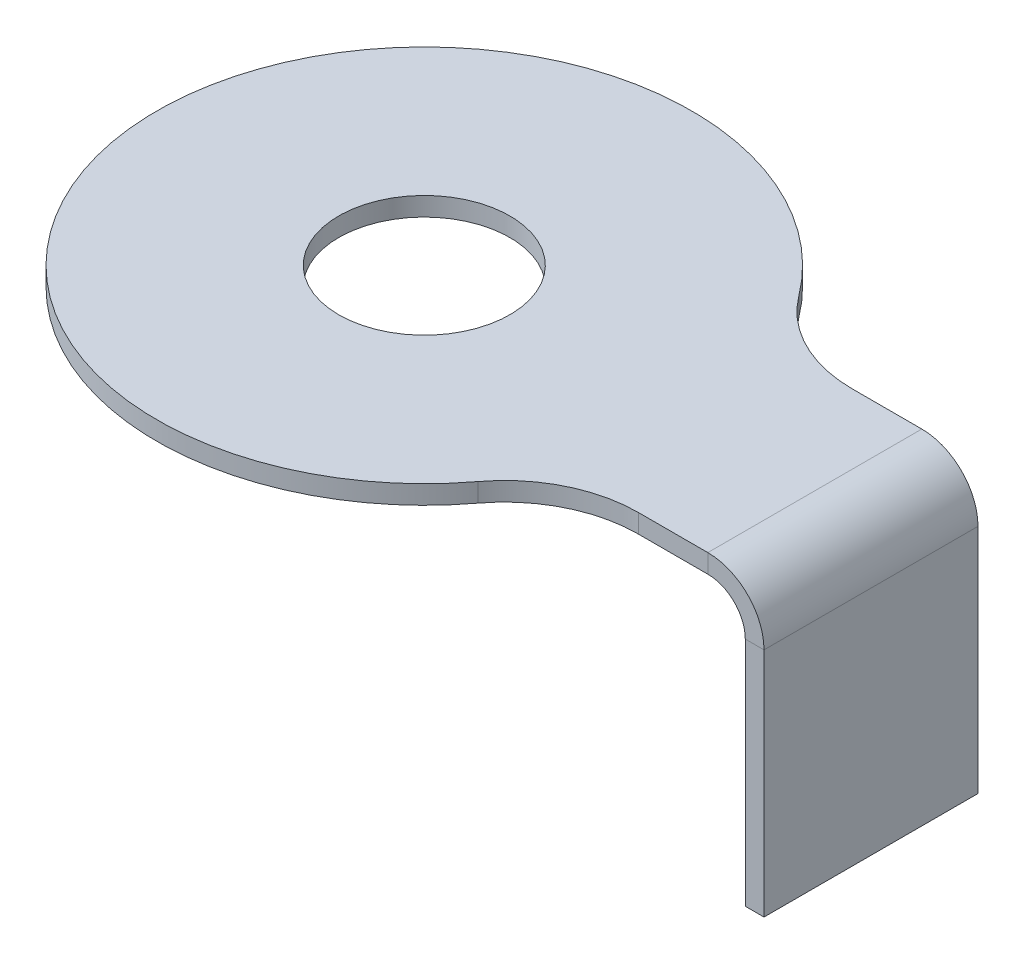
ISO-10303-21;
HEADER;
FILE_DESCRIPTION(('STEP AP214'),'2;1');
FILE_NAME('part.step','',(''),(''),'','','');
FILE_SCHEMA(('AUTOMOTIVE_DESIGN { 1 0 10303 214 1 1 1 1 }'));
ENDSEC;
DATA;
#1=APPLICATION_CONTEXT('core data for automotive mechanical design processes');
#2=APPLICATION_PROTOCOL_DEFINITION('international standard','automotive_design',2000,#1);
#3=PRODUCT_CONTEXT('',#1,'mechanical');
#4=PRODUCT('Part','Part','',(#3));
#5=PRODUCT_RELATED_PRODUCT_CATEGORY('part','',(#4));
#6=PRODUCT_DEFINITION_FORMATION('','',#4);
#7=PRODUCT_DEFINITION_CONTEXT('part definition',#1,'design');
#8=PRODUCT_DEFINITION('design','',#6,#7);
#9=PRODUCT_DEFINITION_SHAPE('','',#8);
#10=(LENGTH_UNIT() NAMED_UNIT(*) SI_UNIT(.MILLI.,.METRE.));
#11=(NAMED_UNIT(*) PLANE_ANGLE_UNIT() SI_UNIT($,.RADIAN.));
#12=(NAMED_UNIT(*) SI_UNIT($,.STERADIAN.) SOLID_ANGLE_UNIT());
#13=UNCERTAINTY_MEASURE_WITH_UNIT(LENGTH_MEASURE(1.E-05),#10,'distance_accuracy_value','');
#14=(GEOMETRIC_REPRESENTATION_CONTEXT(3) GLOBAL_UNCERTAINTY_ASSIGNED_CONTEXT((#13)) GLOBAL_UNIT_ASSIGNED_CONTEXT((#10,
#11,#12)) REPRESENTATION_CONTEXT('',''));
#15=CARTESIAN_POINT('',(0.,0.,0.));
#16=DIRECTION('',(0.,0.,1.));
#17=DIRECTION('',(1.,0.,0.));
#18=AXIS2_PLACEMENT_3D('',#15,#16,#17);
#19=CARTESIAN_POINT('',(8.35000000000001,1.97444678594554,-4.5));
#20=DIRECTION('',(-1.,0.,0.));
#21=DIRECTION('',(0.,0.,-1.));
#22=AXIS2_PLACEMENT_3D('',#19,#20,#21);
#23=PLANE('',#22);
#24=DIRECTION('',(0.,1.,0.));
#25=VECTOR('',#24,1.);
#26=CARTESIAN_POINT('',(8.35000000000001,1.97444678594554,-2.));
#27=LINE('',#26,#25);
#28=CARTESIAN_POINT('',(8.34999999999999,-5.02555321405446,-2.));
#29=VERTEX_POINT('',#28);
#30=CARTESIAN_POINT('',(8.35000000510995,-0.700000000000003,-2.));
#31=VERTEX_POINT('',#30);
#32=EDGE_CURVE('E39',#29,#31,#27,.T.);
#33=ORIENTED_EDGE('',*,*,#32,.T.);
#34=DIRECTION('',(0.,0.,1.));
#35=VECTOR('',#34,1.);
#36=CARTESIAN_POINT('',(8.35,-0.700000000000004,-4.5));
#37=LINE('',#36,#35);
#38=CARTESIAN_POINT('',(8.35,-0.700000000000004,2.));
#39=VERTEX_POINT('',#38);
#40=EDGE_CURVE('E127',#31,#39,#37,.T.);
#41=ORIENTED_EDGE('',*,*,#40,.T.);
#42=DIRECTION('',(0.,-1.,0.));
#43=VECTOR('',#42,1.);
#44=CARTESIAN_POINT('',(8.34999999999999,-5.02555321405446,2.));
#45=LINE('',#44,#43);
#46=CARTESIAN_POINT('',(8.34999999999999,-5.02555321405446,2.));
#47=VERTEX_POINT('',#46);
#48=EDGE_CURVE('E146',#39,#47,#45,.T.);
#49=ORIENTED_EDGE('',*,*,#48,.T.);
#50=DIRECTION('',(0.,0.,-1.));
#51=VECTOR('',#50,1.);
#52=CARTESIAN_POINT('',(8.34999999999999,-5.02555321405446,-2.));
#53=LINE('',#52,#51);
#54=EDGE_CURVE('E60',#47,#29,#53,.T.);
#55=ORIENTED_EDGE('',*,*,#54,.T.);
#56=EDGE_LOOP('',(#33,#41,#49,#55));
#57=FACE_BOUND('',#56,.T.);
#58=ADVANCED_FACE('F35',(#57),#23,.F.);
#59=CARTESIAN_POINT('',(8.34999999999999,-5.02555321405446,2.));
#60=DIRECTION('',(0.,0.,-1.));
#61=DIRECTION('',(0.,1.,0.));
#62=AXIS2_PLACEMENT_3D('',#59,#60,#61);
#63=PLANE('',#62);
#64=ORIENTED_EDGE('',*,*,#48,.F.);
#65=DIRECTION('',(-1.,0.,0.));
#66=VECTOR('',#65,1.);
#67=CARTESIAN_POINT('',(8.35,-0.700000000000004,2.));
#68=LINE('',#67,#66);
#69=CARTESIAN_POINT('',(8.00000000510995,-0.700000000000002,2.));
#70=VERTEX_POINT('',#69);
#71=EDGE_CURVE('E12',#39,#70,#68,.T.);
#72=ORIENTED_EDGE('',*,*,#71,.T.);
#73=DIRECTION('',(0.,-1.,0.));
#74=VECTOR('',#73,1.);
#75=CARTESIAN_POINT('',(7.99999999999999,-5.02555321405446,2.));
#76=LINE('',#75,#74);
#77=CARTESIAN_POINT('',(7.99999999999999,-5.02555321405446,2.));
#78=VERTEX_POINT('',#77);
#79=EDGE_CURVE('E151',#70,#78,#76,.T.);
#80=ORIENTED_EDGE('',*,*,#79,.T.);
#81=DIRECTION('',(-1.,0.,0.));
#82=VECTOR('',#81,1.);
#83=CARTESIAN_POINT('',(8.34999999999999,-5.02555321405446,2.));
#84=LINE('',#83,#82);
#85=EDGE_CURVE('E164',#47,#78,#84,.T.);
#86=ORIENTED_EDGE('',*,*,#85,.F.);
#87=EDGE_LOOP('',(#64,#72,#80,#86));
#88=FACE_BOUND('',#87,.T.);
#89=ADVANCED_FACE('F37',(#88),#63,.F.);
#90=CARTESIAN_POINT('',(8.35000000000001,1.97444678594554,-2.));
#91=DIRECTION('',(0.,0.,1.));
#92=DIRECTION('',(0.,-1.,0.));
#93=AXIS2_PLACEMENT_3D('',#90,#91,#92);
#94=PLANE('',#93);
#95=DIRECTION('',(0.,1.,0.));
#96=VECTOR('',#95,1.);
#97=CARTESIAN_POINT('',(8.00000000000001,1.97444678594554,-2.));
#98=LINE('',#97,#96);
#99=CARTESIAN_POINT('',(7.99999999999999,-5.02555321405446,-2.));
#100=VERTEX_POINT('',#99);
#101=CARTESIAN_POINT('',(8.00000000510995,-0.700000000000002,-2.));
#102=VERTEX_POINT('',#101);
#103=EDGE_CURVE('E141',#100,#102,#98,.T.);
#104=ORIENTED_EDGE('',*,*,#103,.T.);
#105=DIRECTION('',(1.,0.,0.));
#106=VECTOR('',#105,1.);
#107=CARTESIAN_POINT('',(8.35,-0.700000000000004,-2.));
#108=LINE('',#107,#106);
#109=EDGE_CURVE('E117',#102,#31,#108,.T.);
#110=ORIENTED_EDGE('',*,*,#109,.T.);
#111=ORIENTED_EDGE('',*,*,#32,.F.);
#112=DIRECTION('',(-1.,0.,0.));
#113=VECTOR('',#112,1.);
#114=CARTESIAN_POINT('',(8.34999999999999,-5.02555321405446,-2.));
#115=LINE('',#114,#113);
#116=EDGE_CURVE('E143',#29,#100,#115,.T.);
#117=ORIENTED_EDGE('',*,*,#116,.T.);
#118=EDGE_LOOP('',(#104,#110,#111,#117));
#119=FACE_BOUND('',#118,.T.);
#120=ADVANCED_FACE('F142',(#119),#94,.F.);
#121=CARTESIAN_POINT('',(8.00000000000001,1.97444678594554,-4.5));
#122=DIRECTION('',(-1.,0.,0.));
#123=DIRECTION('',(0.,0.,-1.));
#124=AXIS2_PLACEMENT_3D('',#121,#122,#123);
#125=PLANE('',#124);
#126=DIRECTION('',(0.,0.,1.));
#127=VECTOR('',#126,1.);
#128=CARTESIAN_POINT('',(8.,-0.700000000000003,-4.5));
#129=LINE('',#128,#127);
#130=EDGE_CURVE('E44',#102,#70,#129,.T.);
#131=ORIENTED_EDGE('',*,*,#130,.F.);
#132=ORIENTED_EDGE('',*,*,#103,.F.);
#133=DIRECTION('',(0.,0.,-1.));
#134=VECTOR('',#133,1.);
#135=CARTESIAN_POINT('',(7.99999999999999,-5.02555321405446,-2.));
#136=LINE('',#135,#134);
#137=EDGE_CURVE('E147',#78,#100,#136,.T.);
#138=ORIENTED_EDGE('',*,*,#137,.F.);
#139=ORIENTED_EDGE('',*,*,#79,.F.);
#140=EDGE_LOOP('',(#131,#132,#138,#139));
#141=FACE_BOUND('',#140,.T.);
#142=ADVANCED_FACE('F150',(#141),#125,.T.);
#143=CARTESIAN_POINT('',(8.34999999999999,-5.02555321405446,-2.));
#144=DIRECTION('',(0.,1.,0.));
#145=DIRECTION('',(0.,0.,1.));
#146=AXIS2_PLACEMENT_3D('',#143,#144,#145);
#147=PLANE('',#146);
#148=ORIENTED_EDGE('',*,*,#137,.T.);
#149=ORIENTED_EDGE('',*,*,#116,.F.);
#150=ORIENTED_EDGE('',*,*,#54,.F.);
#151=ORIENTED_EDGE('',*,*,#85,.T.);
#152=EDGE_LOOP('',(#148,#149,#150,#151));
#153=FACE_BOUND('',#152,.T.);
#154=ADVANCED_FACE('F168',(#153),#147,.F.);
#155=CARTESIAN_POINT('',(0.,0.35,0.));
#156=DIRECTION('',(0.,-1.,0.));
#157=DIRECTION('',(0.,0.,-1.));
#158=AXIS2_PLACEMENT_3D('',#155,#156,#157);
#159=CYLINDRICAL_SURFACE('',#158,1.6);
#160=CARTESIAN_POINT('',(0.,0.35,0.));
#161=DIRECTION('',(0.,1.,0.));
#162=DIRECTION('',(0.,0.,1.));
#163=AXIS2_PLACEMENT_3D('',#160,#161,#162);
#164=CIRCLE('',#163,1.6);
#165=CARTESIAN_POINT('',(0.,0.35,1.6));
#166=VERTEX_POINT('',#165);
#167=EDGE_CURVE('E326',#166,#166,#164,.T.);
#168=ORIENTED_EDGE('',*,*,#167,.T.);
#169=EDGE_LOOP('',(#168));
#170=FACE_BOUND('',#169,.T.);
#171=CARTESIAN_POINT('',(0.,0.,0.));
#172=DIRECTION('',(0.,1.,0.));
#173=DIRECTION('',(0.,0.,1.));
#174=AXIS2_PLACEMENT_3D('',#171,#172,#173);
#175=CIRCLE('',#174,1.6);
#176=CARTESIAN_POINT('',(0.,0.,1.6));
#177=VERTEX_POINT('',#176);
#178=EDGE_CURVE('E295',#177,#177,#175,.T.);
#179=ORIENTED_EDGE('',*,*,#178,.F.);
#180=EDGE_LOOP('',(#179));
#181=FACE_BOUND('',#180,.T.);
#182=ADVANCED_FACE('F170',(#170,#181),#159,.F.);
#183=CARTESIAN_POINT('',(6.,0.35,4.5));
#184=DIRECTION('',(0.,-1.,0.));
#185=DIRECTION('',(0.,0.,-1.));
#186=AXIS2_PLACEMENT_3D('',#183,#184,#185);
#187=CYLINDRICAL_SURFACE('',#186,2.5);
#188=CARTESIAN_POINT('',(6.,0.,4.5));
#189=DIRECTION('',(0.,-1.,0.));
#190=DIRECTION('',(0.,0.,1.));
#191=AXIS2_PLACEMENT_3D('',#188,#189,#190);
#192=CIRCLE('',#191,2.5);
#193=CARTESIAN_POINT('',(4.,0.,3.));
#194=VERTEX_POINT('',#193);
#195=CARTESIAN_POINT('',(6.,0.,2.));
#196=VERTEX_POINT('',#195);
#197=EDGE_CURVE('E324',#194,#196,#192,.T.);
#198=ORIENTED_EDGE('',*,*,#197,.T.);
#199=DIRECTION('',(0.,-1.,0.));
#200=VECTOR('',#199,1.);
#201=CARTESIAN_POINT('',(6.,0.35,2.));
#202=LINE('',#201,#200);
#203=CARTESIAN_POINT('',(6.,0.35,2.));
#204=VERTEX_POINT('',#203);
#205=EDGE_CURVE('E292',#204,#196,#202,.T.);
#206=ORIENTED_EDGE('',*,*,#205,.F.);
#207=CARTESIAN_POINT('',(6.,0.35,4.5));
#208=DIRECTION('',(0.,-1.,0.));
#209=DIRECTION('',(0.,0.,1.));
#210=AXIS2_PLACEMENT_3D('',#207,#208,#209);
#211=CIRCLE('',#210,2.5);
#212=CARTESIAN_POINT('',(4.,0.35,3.));
#213=VERTEX_POINT('',#212);
#214=EDGE_CURVE('E301',#213,#204,#211,.T.);
#215=ORIENTED_EDGE('',*,*,#214,.F.);
#216=DIRECTION('',(0.,-1.,0.));
#217=VECTOR('',#216,1.);
#218=CARTESIAN_POINT('',(4.,0.35,3.));
#219=LINE('',#218,#217);
#220=EDGE_CURVE('E321',#213,#194,#219,.T.);
#221=ORIENTED_EDGE('',*,*,#220,.T.);
#222=EDGE_LOOP('',(#198,#206,#215,#221));
#223=FACE_BOUND('',#222,.T.);
#224=ADVANCED_FACE('F176',(#223),#187,.F.);
#225=CARTESIAN_POINT('',(0.,0.35,0.));
#226=DIRECTION('',(0.,-1.,0.));
#227=DIRECTION('',(0.,0.,-1.));
#228=AXIS2_PLACEMENT_3D('',#225,#226,#227);
#229=CYLINDRICAL_SURFACE('',#228,5.);
#230=CARTESIAN_POINT('',(0.,0.,0.));
#231=DIRECTION('',(0.,1.,0.));
#232=DIRECTION('',(0.,0.,1.));
#233=AXIS2_PLACEMENT_3D('',#230,#231,#232);
#234=CIRCLE('',#233,5.);
#235=CARTESIAN_POINT('',(4.,0.,-3.));
#236=VERTEX_POINT('',#235);
#237=EDGE_CURVE('E319',#236,#194,#234,.T.);
#238=ORIENTED_EDGE('',*,*,#237,.T.);
#239=ORIENTED_EDGE('',*,*,#220,.F.);
#240=CARTESIAN_POINT('',(0.,0.35,0.));
#241=DIRECTION('',(0.,1.,0.));
#242=DIRECTION('',(0.,0.,1.));
#243=AXIS2_PLACEMENT_3D('',#240,#241,#242);
#244=CIRCLE('',#243,5.);
#245=CARTESIAN_POINT('',(4.,0.35,-3.));
#246=VERTEX_POINT('',#245);
#247=EDGE_CURVE('E303',#246,#213,#244,.T.);
#248=ORIENTED_EDGE('',*,*,#247,.F.);
#249=DIRECTION('',(0.,-1.,0.));
#250=VECTOR('',#249,1.);
#251=CARTESIAN_POINT('',(4.,0.35,-3.));
#252=LINE('',#251,#250);
#253=EDGE_CURVE('E316',#246,#236,#252,.T.);
#254=ORIENTED_EDGE('',*,*,#253,.T.);
#255=EDGE_LOOP('',(#238,#239,#248,#254));
#256=FACE_BOUND('',#255,.T.);
#257=ADVANCED_FACE('F262',(#256),#229,.T.);
#258=CARTESIAN_POINT('',(6.,0.35,-4.5));
#259=DIRECTION('',(0.,-1.,0.));
#260=DIRECTION('',(0.,0.,-1.));
#261=AXIS2_PLACEMENT_3D('',#258,#259,#260);
#262=CYLINDRICAL_SURFACE('',#261,2.5);
#263=CARTESIAN_POINT('',(6.,0.,-4.5));
#264=DIRECTION('',(0.,-1.,0.));
#265=DIRECTION('',(0.,0.,-1.));
#266=AXIS2_PLACEMENT_3D('',#263,#264,#265);
#267=CIRCLE('',#266,2.5);
#268=CARTESIAN_POINT('',(6.,0.,-2.));
#269=VERTEX_POINT('',#268);
#270=EDGE_CURVE('E313',#269,#236,#267,.T.);
#271=ORIENTED_EDGE('',*,*,#270,.T.);
#272=ORIENTED_EDGE('',*,*,#253,.F.);
#273=CARTESIAN_POINT('',(6.,0.35,-4.5));
#274=DIRECTION('',(0.,-1.,0.));
#275=DIRECTION('',(0.,0.,-1.));
#276=AXIS2_PLACEMENT_3D('',#273,#274,#275);
#277=CIRCLE('',#276,2.5);
#278=CARTESIAN_POINT('',(6.,0.35,-2.));
#279=VERTEX_POINT('',#278);
#280=EDGE_CURVE('E305',#279,#246,#277,.T.);
#281=ORIENTED_EDGE('',*,*,#280,.F.);
#282=DIRECTION('',(0.,-1.,0.));
#283=VECTOR('',#282,1.);
#284=CARTESIAN_POINT('',(6.,0.35,-2.));
#285=LINE('',#284,#283);
#286=EDGE_CURVE('E310',#279,#269,#285,.T.);
#287=ORIENTED_EDGE('',*,*,#286,.T.);
#288=EDGE_LOOP('',(#271,#272,#281,#287));
#289=FACE_BOUND('',#288,.T.);
#290=ADVANCED_FACE('F213',(#289),#262,.F.);
#291=CARTESIAN_POINT('',(6.,0.35,-4.5));
#292=DIRECTION('',(0.,-1.,0.));
#293=DIRECTION('',(0.,0.,-1.));
#294=AXIS2_PLACEMENT_3D('',#291,#292,#293);
#295=PLANE('',#294);
#296=DIRECTION('',(0.,0.,1.));
#297=VECTOR('',#296,1.);
#298=CARTESIAN_POINT('',(7.3,0.35,-4.5));
#299=LINE('',#298,#297);
#300=CARTESIAN_POINT('',(7.3,0.350000002554975,-2.));
#301=VERTEX_POINT('',#300);
#302=CARTESIAN_POINT('',(7.3,0.35,2.));
#303=VERTEX_POINT('',#302);
#304=EDGE_CURVE('E284',#301,#303,#299,.T.);
#305=ORIENTED_EDGE('',*,*,#304,.F.);
#306=DIRECTION('',(-1.,0.,0.));
#307=VECTOR('',#306,1.);
#308=CARTESIAN_POINT('',(6.,0.35,-2.));
#309=LINE('',#308,#307);
#310=EDGE_CURVE('E308',#301,#279,#309,.T.);
#311=ORIENTED_EDGE('',*,*,#310,.T.);
#312=ORIENTED_EDGE('',*,*,#280,.T.);
#313=ORIENTED_EDGE('',*,*,#247,.T.);
#314=ORIENTED_EDGE('',*,*,#214,.T.);
#315=DIRECTION('',(1.,0.,0.));
#316=VECTOR('',#315,1.);
#317=CARTESIAN_POINT('',(13.,0.35,2.));
#318=LINE('',#317,#316);
#319=EDGE_CURVE('E281',#204,#303,#318,.T.);
#320=ORIENTED_EDGE('',*,*,#319,.T.);
#321=EDGE_LOOP('',(#305,#311,#312,#313,#314,#320));
#322=FACE_BOUND('',#321,.T.);
#323=ORIENTED_EDGE('',*,*,#167,.F.);
#324=EDGE_LOOP('',(#323));
#325=FACE_BOUND('',#324,.T.);
#326=ADVANCED_FACE('F206',(#322,#325),#295,.F.);
#327=CARTESIAN_POINT('',(6.,0.35,-2.));
#328=DIRECTION('',(0.,0.,1.));
#329=DIRECTION('',(1.,0.,0.));
#330=AXIS2_PLACEMENT_3D('',#327,#328,#329);
#331=PLANE('',#330);
#332=DIRECTION('',(0.,1.,0.));
#333=VECTOR('',#332,1.);
#334=CARTESIAN_POINT('',(7.3,0.35,-2.));
#335=LINE('',#334,#333);
#336=CARTESIAN_POINT('',(7.3,0.,-2.));
#337=VERTEX_POINT('',#336);
#338=EDGE_CURVE('E283',#337,#301,#335,.T.);
#339=ORIENTED_EDGE('',*,*,#338,.F.);
#340=DIRECTION('',(-1.,0.,0.));
#341=VECTOR('',#340,1.);
#342=CARTESIAN_POINT('',(6.,0.,-2.));
#343=LINE('',#342,#341);
#344=EDGE_CURVE('E298',#337,#269,#343,.T.);
#345=ORIENTED_EDGE('',*,*,#344,.T.);
#346=ORIENTED_EDGE('',*,*,#286,.F.);
#347=ORIENTED_EDGE('',*,*,#310,.F.);
#348=EDGE_LOOP('',(#339,#345,#346,#347));
#349=FACE_BOUND('',#348,.T.);
#350=ADVANCED_FACE('F212',(#349),#331,.F.);
#351=CARTESIAN_POINT('',(6.,0.,-4.5));
#352=DIRECTION('',(0.,-1.,0.));
#353=DIRECTION('',(0.,0.,-1.));
#354=AXIS2_PLACEMENT_3D('',#351,#352,#353);
#355=PLANE('',#354);
#356=ORIENTED_EDGE('',*,*,#178,.T.);
#357=EDGE_LOOP('',(#356));
#358=FACE_BOUND('',#357,.T.);
#359=ORIENTED_EDGE('',*,*,#344,.F.);
#360=DIRECTION('',(0.,0.,1.));
#361=VECTOR('',#360,1.);
#362=CARTESIAN_POINT('',(7.3,0.,-4.5));
#363=LINE('',#362,#361);
#364=CARTESIAN_POINT('',(7.3,0.,2.));
#365=VERTEX_POINT('',#364);
#366=EDGE_CURVE('E136',#337,#365,#363,.T.);
#367=ORIENTED_EDGE('',*,*,#366,.T.);
#368=DIRECTION('',(1.,0.,0.));
#369=VECTOR('',#368,1.);
#370=CARTESIAN_POINT('',(13.,0.,2.));
#371=LINE('',#370,#369);
#372=EDGE_CURVE('E155',#196,#365,#371,.T.);
#373=ORIENTED_EDGE('',*,*,#372,.F.);
#374=ORIENTED_EDGE('',*,*,#197,.F.);
#375=ORIENTED_EDGE('',*,*,#237,.F.);
#376=ORIENTED_EDGE('',*,*,#270,.F.);
#377=EDGE_LOOP('',(#359,#367,#373,#374,#375,#376));
#378=FACE_BOUND('',#377,.T.);
#379=ADVANCED_FACE('F270',(#358,#378),#355,.T.);
#380=CARTESIAN_POINT('',(13.,0.35,2.));
#381=DIRECTION('',(0.,0.,-1.));
#382=DIRECTION('',(-1.,0.,0.));
#383=AXIS2_PLACEMENT_3D('',#380,#381,#382);
#384=PLANE('',#383);
#385=DIRECTION('',(0.,-1.,0.));
#386=VECTOR('',#385,1.);
#387=CARTESIAN_POINT('',(7.3,0.35,2.));
#388=LINE('',#387,#386);
#389=EDGE_CURVE('E279',#303,#365,#388,.T.);
#390=ORIENTED_EDGE('',*,*,#389,.F.);
#391=ORIENTED_EDGE('',*,*,#319,.F.);
#392=ORIENTED_EDGE('',*,*,#205,.T.);
#393=ORIENTED_EDGE('',*,*,#372,.T.);
#394=EDGE_LOOP('',(#390,#391,#392,#393));
#395=FACE_BOUND('',#394,.T.);
#396=ADVANCED_FACE('F228',(#395),#384,.F.);
#397=CARTESIAN_POINT('',(7.3,-0.700000005109949,-2.));
#398=DIRECTION('',(0.,0.,-1.));
#399=DIRECTION('',(-1.,0.,0.));
#400=AXIS2_PLACEMENT_3D('',#397,#398,#399);
#401=PLANE('',#400);
#402=ORIENTED_EDGE('',*,*,#109,.F.);
#403=CARTESIAN_POINT('',(7.3,-0.7,-2.));
#404=DIRECTION('',(0.,0.,-1.));
#405=DIRECTION('',(-1.,0.,0.));
#406=AXIS2_PLACEMENT_3D('',#403,#404,#405);
#407=CIRCLE('',#406,0.700000005109949);
#408=EDGE_CURVE('E121',#102,#337,#407,.F.);
#409=ORIENTED_EDGE('',*,*,#408,.T.);
#410=ORIENTED_EDGE('',*,*,#338,.T.);
#411=CARTESIAN_POINT('',(7.3,-0.700000005109949,-2.));
#412=DIRECTION('',(0.,0.,1.));
#413=DIRECTION('',(1.,0.,0.));
#414=AXIS2_PLACEMENT_3D('',#411,#412,#413);
#415=CIRCLE('',#414,1.05000000766492);
#416=EDGE_CURVE('E123',#31,#301,#415,.T.);
#417=ORIENTED_EDGE('',*,*,#416,.F.);
#418=EDGE_LOOP('',(#402,#409,#410,#417));
#419=FACE_BOUND('',#418,.T.);
#420=ADVANCED_FACE('F119',(#419),#401,.T.);
#421=CARTESIAN_POINT('',(7.3,-0.700000005109949,2.));
#422=DIRECTION('',(0.,0.,1.));
#423=DIRECTION('',(1.,0.,0.));
#424=AXIS2_PLACEMENT_3D('',#421,#422,#423);
#425=PLANE('',#424);
#426=CARTESIAN_POINT('',(7.3,-0.7,2.));
#427=DIRECTION('',(0.,0.,-1.));
#428=DIRECTION('',(-1.,0.,0.));
#429=AXIS2_PLACEMENT_3D('',#426,#427,#428);
#430=CIRCLE('',#429,0.700000005109949);
#431=EDGE_CURVE('E137',#365,#70,#430,.T.);
#432=ORIENTED_EDGE('',*,*,#431,.T.);
#433=ORIENTED_EDGE('',*,*,#71,.F.);
#434=CARTESIAN_POINT('',(7.3,-0.700000005109949,2.));
#435=DIRECTION('',(0.,0.,-1.));
#436=DIRECTION('',(-1.,0.,0.));
#437=AXIS2_PLACEMENT_3D('',#434,#435,#436);
#438=CIRCLE('',#437,1.05000000766492);
#439=EDGE_CURVE('E52',#303,#39,#438,.T.);
#440=ORIENTED_EDGE('',*,*,#439,.F.);
#441=ORIENTED_EDGE('',*,*,#389,.T.);
#442=EDGE_LOOP('',(#432,#433,#440,#441));
#443=FACE_BOUND('',#442,.T.);
#444=ADVANCED_FACE('F227',(#443),#425,.T.);
#445=CARTESIAN_POINT('',(7.3,-0.7,4.24400800746134));
#446=DIRECTION('',(0.,0.,-1.));
#447=DIRECTION('',(-1.,0.,0.));
#448=AXIS2_PLACEMENT_3D('',#445,#446,#447);
#449=CYLINDRICAL_SURFACE('',#448,1.05000000510995);
#450=ORIENTED_EDGE('',*,*,#304,.T.);
#451=ORIENTED_EDGE('',*,*,#439,.T.);
#452=ORIENTED_EDGE('',*,*,#40,.F.);
#453=ORIENTED_EDGE('',*,*,#416,.T.);
#454=EDGE_LOOP('',(#450,#451,#452,#453));
#455=FACE_BOUND('',#454,.T.);
#456=ADVANCED_FACE('F230',(#455),#449,.T.);
#457=CARTESIAN_POINT('',(7.3,-0.7,4.24400800746134));
#458=DIRECTION('',(0.,0.,-1.));
#459=DIRECTION('',(-1.,0.,0.));
#460=AXIS2_PLACEMENT_3D('',#457,#458,#459);
#461=CYLINDRICAL_SURFACE('',#460,0.700000005109949);
#462=ORIENTED_EDGE('',*,*,#366,.F.);
#463=ORIENTED_EDGE('',*,*,#408,.F.);
#464=ORIENTED_EDGE('',*,*,#130,.T.);
#465=ORIENTED_EDGE('',*,*,#431,.F.);
#466=EDGE_LOOP('',(#462,#463,#464,#465));
#467=FACE_BOUND('',#466,.T.);
#468=ADVANCED_FACE('F131',(#467),#461,.F.);
#469=CLOSED_SHELL('',(#58,#89,#120,#142,#154,#182,#224,#257,#290,#326,#350,#379,#396,#420,#444,
#456,#468));
#470=MANIFOLD_SOLID_BREP('B2',#469);
#471=ADVANCED_BREP_SHAPE_REPRESENTATION('',(#18,#470),#14);
#472=SHAPE_DEFINITION_REPRESENTATION(#9,#471);
ENDSEC;
END-ISO-10303-21;
